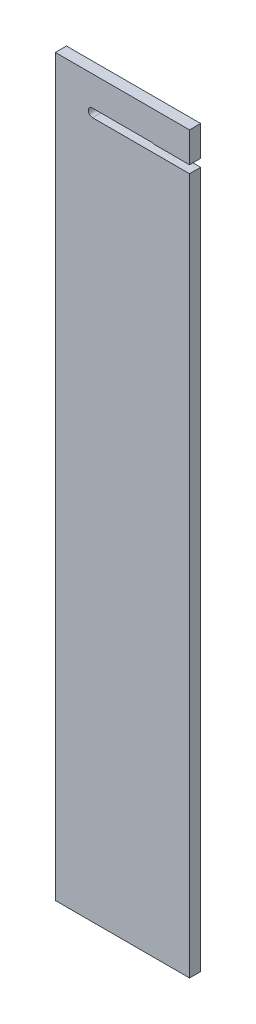
ISO-10303-21;
HEADER;
FILE_DESCRIPTION(('STEP AP214'),'2;1');
FILE_NAME('part.step','',(''),(''),'','','');
FILE_SCHEMA(('AUTOMOTIVE_DESIGN { 1 0 10303 214 1 1 1 1 }'));
ENDSEC;
DATA;
#1=APPLICATION_CONTEXT('core data for automotive mechanical design processes');
#2=APPLICATION_PROTOCOL_DEFINITION('international standard','automotive_design',2000,#1);
#3=PRODUCT_CONTEXT('',#1,'mechanical');
#4=PRODUCT('Part','Part','',(#3));
#5=PRODUCT_RELATED_PRODUCT_CATEGORY('part','',(#4));
#6=PRODUCT_DEFINITION_FORMATION('','',#4);
#7=PRODUCT_DEFINITION_CONTEXT('part definition',#1,'design');
#8=PRODUCT_DEFINITION('design','',#6,#7);
#9=PRODUCT_DEFINITION_SHAPE('','',#8);
#10=(LENGTH_UNIT() NAMED_UNIT(*) SI_UNIT(.MILLI.,.METRE.));
#11=(NAMED_UNIT(*) PLANE_ANGLE_UNIT() SI_UNIT($,.RADIAN.));
#12=(NAMED_UNIT(*) SI_UNIT($,.STERADIAN.) SOLID_ANGLE_UNIT());
#13=UNCERTAINTY_MEASURE_WITH_UNIT(LENGTH_MEASURE(1.E-05),#10,'distance_accuracy_value','');
#14=(GEOMETRIC_REPRESENTATION_CONTEXT(3) GLOBAL_UNCERTAINTY_ASSIGNED_CONTEXT((#13)) GLOBAL_UNIT_ASSIGNED_CONTEXT((#10,
#11,#12)) REPRESENTATION_CONTEXT('',''));
#15=CARTESIAN_POINT('',(0.,0.,0.));
#16=DIRECTION('',(0.,0.,1.));
#17=DIRECTION('',(1.,0.,0.));
#18=AXIS2_PLACEMENT_3D('',#15,#16,#17);
#19=CARTESIAN_POINT('',(28.75,0.,4.7625));
#20=DIRECTION('',(1.,0.,0.));
#21=DIRECTION('',(0.,0.,-1.));
#22=AXIS2_PLACEMENT_3D('',#19,#20,#21);
#23=PLANE('',#22);
#24=DIRECTION('',(0.,-1.,0.));
#25=VECTOR('',#24,1.);
#26=CARTESIAN_POINT('',(28.75,0.,0.));
#27=LINE('',#26,#25);
#28=CARTESIAN_POINT('',(28.75,149.225,0.));
#29=VERTEX_POINT('',#28);
#30=CARTESIAN_POINT('',(28.75,-149.225,0.));
#31=VERTEX_POINT('',#30);
#32=EDGE_CURVE('E120',#29,#31,#27,.T.);
#33=ORIENTED_EDGE('',*,*,#32,.F.);
#34=DIRECTION('',(0.,0.,-1.));
#35=VECTOR('',#34,1.);
#36=CARTESIAN_POINT('',(28.75,149.225,4.7625));
#37=LINE('',#36,#35);
#38=CARTESIAN_POINT('',(28.75,149.225,4.7625));
#39=VERTEX_POINT('',#38);
#40=EDGE_CURVE('E116',#39,#29,#37,.T.);
#41=ORIENTED_EDGE('',*,*,#40,.F.);
#42=DIRECTION('',(0.,-1.,0.));
#43=VECTOR('',#42,1.);
#44=CARTESIAN_POINT('',(28.75,0.,4.7625));
#45=LINE('',#44,#43);
#46=CARTESIAN_POINT('',(28.75,-149.225,4.7625));
#47=VERTEX_POINT('',#46);
#48=EDGE_CURVE('E118',#39,#47,#45,.T.);
#49=ORIENTED_EDGE('',*,*,#48,.T.);
#50=DIRECTION('',(0.,0.,-1.));
#51=VECTOR('',#50,1.);
#52=CARTESIAN_POINT('',(28.75,-149.225,4.7625));
#53=LINE('',#52,#51);
#54=EDGE_CURVE('E156',#47,#31,#53,.T.);
#55=ORIENTED_EDGE('',*,*,#54,.T.);
#56=EDGE_LOOP('',(#33,#41,#49,#55));
#57=FACE_BOUND('',#56,.T.);
#58=ADVANCED_FACE('F39',(#57),#23,.T.);
#59=CARTESIAN_POINT('',(0.,149.225,4.7625));
#60=DIRECTION('',(0.,1.,0.));
#61=DIRECTION('',(0.,0.,1.));
#62=AXIS2_PLACEMENT_3D('',#59,#60,#61);
#63=PLANE('',#62);
#64=DIRECTION('',(1.,0.,0.));
#65=VECTOR('',#64,1.);
#66=CARTESIAN_POINT('',(0.,149.225,0.));
#67=LINE('',#66,#65);
#68=CARTESIAN_POINT('',(-12.827,149.225,0.));
#69=VERTEX_POINT('',#68);
#70=EDGE_CURVE('E158',#69,#29,#67,.T.);
#71=ORIENTED_EDGE('',*,*,#70,.F.);
#72=DIRECTION('',(0.,0.,-1.));
#73=VECTOR('',#72,1.);
#74=CARTESIAN_POINT('',(-12.827,149.225,4.7625));
#75=LINE('',#74,#73);
#76=CARTESIAN_POINT('',(-12.827,149.225,4.7625));
#77=VERTEX_POINT('',#76);
#78=EDGE_CURVE('E126',#77,#69,#75,.T.);
#79=ORIENTED_EDGE('',*,*,#78,.F.);
#80=DIRECTION('',(1.,0.,0.));
#81=VECTOR('',#80,1.);
#82=CARTESIAN_POINT('',(0.,149.225,4.7625));
#83=LINE('',#82,#81);
#84=EDGE_CURVE('E131',#77,#39,#83,.T.);
#85=ORIENTED_EDGE('',*,*,#84,.T.);
#86=ORIENTED_EDGE('',*,*,#40,.T.);
#87=EDGE_LOOP('',(#71,#79,#85,#86));
#88=FACE_BOUND('',#87,.T.);
#89=ADVANCED_FACE('F138',(#88),#63,.T.);
#90=CARTESIAN_POINT('',(-12.827,151.003,4.7625));
#91=DIRECTION('',(0.,0.,-1.));
#92=DIRECTION('',(-1.,0.,0.));
#93=AXIS2_PLACEMENT_3D('',#90,#91,#92);
#94=CYLINDRICAL_SURFACE('',#93,1.778);
#95=CARTESIAN_POINT('',(-12.827,151.003,0.));
#96=DIRECTION('',(0.,0.,1.));
#97=DIRECTION('',(1.,0.,0.));
#98=AXIS2_PLACEMENT_3D('',#95,#96,#97);
#99=CIRCLE('',#98,1.778);
#100=CARTESIAN_POINT('',(-12.827,152.781,0.));
#101=VERTEX_POINT('',#100);
#102=EDGE_CURVE('E160',#101,#69,#99,.T.);
#103=ORIENTED_EDGE('',*,*,#102,.F.);
#104=DIRECTION('',(0.,0.,-1.));
#105=VECTOR('',#104,1.);
#106=CARTESIAN_POINT('',(-12.827,152.781,4.7625));
#107=LINE('',#106,#105);
#108=CARTESIAN_POINT('',(-12.827,152.781,4.7625));
#109=VERTEX_POINT('',#108);
#110=EDGE_CURVE('E191',#109,#101,#107,.T.);
#111=ORIENTED_EDGE('',*,*,#110,.F.);
#112=CARTESIAN_POINT('',(-12.827,151.003,4.7625));
#113=DIRECTION('',(0.,0.,1.));
#114=DIRECTION('',(1.,0.,0.));
#115=AXIS2_PLACEMENT_3D('',#112,#113,#114);
#116=CIRCLE('',#115,1.778);
#117=EDGE_CURVE('E139',#109,#77,#116,.T.);
#118=ORIENTED_EDGE('',*,*,#117,.T.);
#119=ORIENTED_EDGE('',*,*,#78,.T.);
#120=EDGE_LOOP('',(#103,#111,#118,#119));
#121=FACE_BOUND('',#120,.T.);
#122=ADVANCED_FACE('F221',(#121),#94,.F.);
#123=CARTESIAN_POINT('',(0.,152.781,4.7625));
#124=DIRECTION('',(0.,-1.,0.));
#125=DIRECTION('',(0.,0.,-1.));
#126=AXIS2_PLACEMENT_3D('',#123,#124,#125);
#127=PLANE('',#126);
#128=DIRECTION('',(-1.,0.,0.));
#129=VECTOR('',#128,1.);
#130=CARTESIAN_POINT('',(0.,152.781,0.));
#131=LINE('',#130,#129);
#132=CARTESIAN_POINT('',(12.827,152.781,0.));
#133=VERTEX_POINT('',#132);
#134=EDGE_CURVE('E163',#133,#101,#131,.T.);
#135=ORIENTED_EDGE('',*,*,#134,.F.);
#136=DIRECTION('',(0.,0.,-1.));
#137=VECTOR('',#136,1.);
#138=CARTESIAN_POINT('',(12.827,152.781,4.7625));
#139=LINE('',#138,#137);
#140=CARTESIAN_POINT('',(12.827,152.781,4.7625));
#141=VERTEX_POINT('',#140);
#142=EDGE_CURVE('E189',#141,#133,#139,.T.);
#143=ORIENTED_EDGE('',*,*,#142,.F.);
#144=DIRECTION('',(-1.,0.,0.));
#145=VECTOR('',#144,1.);
#146=CARTESIAN_POINT('',(0.,152.781,4.7625));
#147=LINE('',#146,#145);
#148=EDGE_CURVE('E141',#141,#109,#147,.T.);
#149=ORIENTED_EDGE('',*,*,#148,.T.);
#150=ORIENTED_EDGE('',*,*,#110,.T.);
#151=EDGE_LOOP('',(#135,#143,#149,#150));
#152=FACE_BOUND('',#151,.T.);
#153=ADVANCED_FACE('F200',(#152),#127,.T.);
#154=CARTESIAN_POINT('',(0.,152.527,4.7625));
#155=DIRECTION('',(0.,-1.,0.));
#156=DIRECTION('',(0.,0.,-1.));
#157=AXIS2_PLACEMENT_3D('',#154,#155,#156);
#158=PLANE('',#157);
#159=DIRECTION('',(-1.,0.,0.));
#160=VECTOR('',#159,1.);
#161=CARTESIAN_POINT('',(0.,152.527,4.7625));
#162=LINE('',#161,#160);
#163=CARTESIAN_POINT('',(28.75,152.527,4.7625));
#164=VERTEX_POINT('',#163);
#165=CARTESIAN_POINT('',(14.0713407893338,152.527,4.7625));
#166=VERTEX_POINT('',#165);
#167=EDGE_CURVE('E146',#164,#166,#162,.T.);
#168=ORIENTED_EDGE('',*,*,#167,.T.);
#169=DIRECTION('',(0.,0.,-1.));
#170=VECTOR('',#169,1.);
#171=CARTESIAN_POINT('',(14.0713407893338,152.527,0.));
#172=LINE('',#171,#170);
#173=CARTESIAN_POINT('',(14.0713407893338,152.527,0.));
#174=VERTEX_POINT('',#173);
#175=EDGE_CURVE('E125',#166,#174,#172,.T.);
#176=ORIENTED_EDGE('',*,*,#175,.T.);
#177=DIRECTION('',(-1.,0.,0.));
#178=VECTOR('',#177,1.);
#179=CARTESIAN_POINT('',(0.,152.527,0.));
#180=LINE('',#179,#178);
#181=CARTESIAN_POINT('',(28.75,152.527,0.));
#182=VERTEX_POINT('',#181);
#183=EDGE_CURVE('E166',#182,#174,#180,.T.);
#184=ORIENTED_EDGE('',*,*,#183,.F.);
#185=DIRECTION('',(0.,0.,-1.));
#186=VECTOR('',#185,1.);
#187=CARTESIAN_POINT('',(28.75,152.527,4.7625));
#188=LINE('',#187,#186);
#189=EDGE_CURVE('E187',#164,#182,#188,.T.);
#190=ORIENTED_EDGE('',*,*,#189,.F.);
#191=EDGE_LOOP('',(#168,#176,#184,#190));
#192=FACE_BOUND('',#191,.T.);
#193=ADVANCED_FACE('F203',(#192),#158,.T.);
#194=CARTESIAN_POINT('',(28.75,0.,4.7625));
#195=DIRECTION('',(-1.,0.,0.));
#196=DIRECTION('',(0.,0.,1.));
#197=AXIS2_PLACEMENT_3D('',#194,#195,#196);
#198=PLANE('',#197);
#199=DIRECTION('',(0.,1.,0.));
#200=VECTOR('',#199,1.);
#201=CARTESIAN_POINT('',(28.75,0.,0.));
#202=LINE('',#201,#200);
#203=CARTESIAN_POINT('',(28.75,165.481,0.));
#204=VERTEX_POINT('',#203);
#205=EDGE_CURVE('E169',#182,#204,#202,.T.);
#206=ORIENTED_EDGE('',*,*,#205,.T.);
#207=DIRECTION('',(0.,0.,-1.));
#208=VECTOR('',#207,1.);
#209=CARTESIAN_POINT('',(28.75,165.481,4.7625));
#210=LINE('',#209,#208);
#211=CARTESIAN_POINT('',(28.75,165.481,4.7625));
#212=VERTEX_POINT('',#211);
#213=EDGE_CURVE('E185',#212,#204,#210,.T.);
#214=ORIENTED_EDGE('',*,*,#213,.F.);
#215=DIRECTION('',(0.,1.,0.));
#216=VECTOR('',#215,1.);
#217=CARTESIAN_POINT('',(28.75,0.,4.7625));
#218=LINE('',#217,#216);
#219=EDGE_CURVE('E148',#164,#212,#218,.T.);
#220=ORIENTED_EDGE('',*,*,#219,.F.);
#221=ORIENTED_EDGE('',*,*,#189,.T.);
#222=EDGE_LOOP('',(#206,#214,#220,#221));
#223=FACE_BOUND('',#222,.T.);
#224=ADVANCED_FACE('F208',(#223),#198,.F.);
#225=CARTESIAN_POINT('',(0.,165.481,4.7625));
#226=DIRECTION('',(0.,1.,0.));
#227=DIRECTION('',(0.,0.,1.));
#228=AXIS2_PLACEMENT_3D('',#225,#226,#227);
#229=PLANE('',#228);
#230=DIRECTION('',(1.,0.,0.));
#231=VECTOR('',#230,1.);
#232=CARTESIAN_POINT('',(0.,165.481,0.));
#233=LINE('',#232,#231);
#234=CARTESIAN_POINT('',(-28.75,165.481,0.));
#235=VERTEX_POINT('',#234);
#236=EDGE_CURVE('E172',#235,#204,#233,.T.);
#237=ORIENTED_EDGE('',*,*,#236,.F.);
#238=DIRECTION('',(0.,0.,-1.));
#239=VECTOR('',#238,1.);
#240=CARTESIAN_POINT('',(-28.75,165.481,4.7625));
#241=LINE('',#240,#239);
#242=CARTESIAN_POINT('',(-28.75,165.481,4.7625));
#243=VERTEX_POINT('',#242);
#244=EDGE_CURVE('E183',#243,#235,#241,.T.);
#245=ORIENTED_EDGE('',*,*,#244,.F.);
#246=DIRECTION('',(1.,0.,0.));
#247=VECTOR('',#246,1.);
#248=CARTESIAN_POINT('',(0.,165.481,4.7625));
#249=LINE('',#248,#247);
#250=EDGE_CURVE('E150',#243,#212,#249,.T.);
#251=ORIENTED_EDGE('',*,*,#250,.T.);
#252=ORIENTED_EDGE('',*,*,#213,.T.);
#253=EDGE_LOOP('',(#237,#245,#251,#252));
#254=FACE_BOUND('',#253,.T.);
#255=ADVANCED_FACE('F211',(#254),#229,.T.);
#256=CARTESIAN_POINT('',(-28.75,0.,4.7625));
#257=DIRECTION('',(1.,0.,0.));
#258=DIRECTION('',(0.,0.,-1.));
#259=AXIS2_PLACEMENT_3D('',#256,#257,#258);
#260=PLANE('',#259);
#261=DIRECTION('',(0.,-1.,0.));
#262=VECTOR('',#261,1.);
#263=CARTESIAN_POINT('',(-28.75,0.,0.));
#264=LINE('',#263,#262);
#265=CARTESIAN_POINT('',(-28.75,-149.225,0.));
#266=VERTEX_POINT('',#265);
#267=EDGE_CURVE('E175',#235,#266,#264,.T.);
#268=ORIENTED_EDGE('',*,*,#267,.T.);
#269=DIRECTION('',(0.,0.,-1.));
#270=VECTOR('',#269,1.);
#271=CARTESIAN_POINT('',(-28.75,-149.225,4.7625));
#272=LINE('',#271,#270);
#273=CARTESIAN_POINT('',(-28.75,-149.225,4.7625));
#274=VERTEX_POINT('',#273);
#275=EDGE_CURVE('E180',#274,#266,#272,.T.);
#276=ORIENTED_EDGE('',*,*,#275,.F.);
#277=DIRECTION('',(0.,-1.,0.));
#278=VECTOR('',#277,1.);
#279=CARTESIAN_POINT('',(-28.75,0.,4.7625));
#280=LINE('',#279,#278);
#281=EDGE_CURVE('E153',#243,#274,#280,.T.);
#282=ORIENTED_EDGE('',*,*,#281,.F.);
#283=ORIENTED_EDGE('',*,*,#244,.T.);
#284=EDGE_LOOP('',(#268,#276,#282,#283));
#285=FACE_BOUND('',#284,.T.);
#286=ADVANCED_FACE('F216',(#285),#260,.F.);
#287=CARTESIAN_POINT('',(0.,-149.225,4.7625));
#288=DIRECTION('',(0.,1.,0.));
#289=DIRECTION('',(0.,0.,1.));
#290=AXIS2_PLACEMENT_3D('',#287,#288,#289);
#291=PLANE('',#290);
#292=DIRECTION('',(1.,0.,0.));
#293=VECTOR('',#292,1.);
#294=CARTESIAN_POINT('',(0.,-149.225,0.));
#295=LINE('',#294,#293);
#296=EDGE_CURVE('E136',#266,#31,#295,.T.);
#297=ORIENTED_EDGE('',*,*,#296,.T.);
#298=ORIENTED_EDGE('',*,*,#54,.F.);
#299=DIRECTION('',(1.,0.,0.));
#300=VECTOR('',#299,1.);
#301=CARTESIAN_POINT('',(0.,-149.225,4.7625));
#302=LINE('',#301,#300);
#303=EDGE_CURVE('E134',#274,#47,#302,.T.);
#304=ORIENTED_EDGE('',*,*,#303,.F.);
#305=ORIENTED_EDGE('',*,*,#275,.T.);
#306=EDGE_LOOP('',(#297,#298,#304,#305));
#307=FACE_BOUND('',#306,.T.);
#308=ADVANCED_FACE('F219',(#307),#291,.F.);
#309=CARTESIAN_POINT('',(0.,0.,4.7625));
#310=DIRECTION('',(0.,0.,1.));
#311=DIRECTION('',(1.,0.,0.));
#312=AXIS2_PLACEMENT_3D('',#309,#310,#311);
#313=PLANE('',#312);
#314=ORIENTED_EDGE('',*,*,#148,.F.);
#315=CARTESIAN_POINT('',(14.0713407893338,155.702,4.7625));
#316=DIRECTION('',(0.,0.,1.));
#317=DIRECTION('',(1.,0.,0.));
#318=AXIS2_PLACEMENT_3D('',#315,#316,#317);
#319=CIRCLE('',#318,3.175);
#320=EDGE_CURVE('E11',#141,#166,#319,.T.);
#321=ORIENTED_EDGE('',*,*,#320,.T.);
#322=ORIENTED_EDGE('',*,*,#167,.F.);
#323=ORIENTED_EDGE('',*,*,#219,.T.);
#324=ORIENTED_EDGE('',*,*,#250,.F.);
#325=ORIENTED_EDGE('',*,*,#281,.T.);
#326=ORIENTED_EDGE('',*,*,#303,.T.);
#327=ORIENTED_EDGE('',*,*,#48,.F.);
#328=ORIENTED_EDGE('',*,*,#84,.F.);
#329=ORIENTED_EDGE('',*,*,#117,.F.);
#330=EDGE_LOOP('',(#314,#321,#322,#323,#324,#325,#326,#327,#328,#329));
#331=FACE_BOUND('',#330,.T.);
#332=ADVANCED_FACE('F129',(#331),#313,.T.);
#333=CARTESIAN_POINT('',(0.,0.,0.));
#334=DIRECTION('',(0.,0.,1.));
#335=DIRECTION('',(1.,0.,0.));
#336=AXIS2_PLACEMENT_3D('',#333,#334,#335);
#337=PLANE('',#336);
#338=ORIENTED_EDGE('',*,*,#183,.T.);
#339=CARTESIAN_POINT('',(14.0713407893338,155.702,0.));
#340=DIRECTION('',(0.,0.,1.));
#341=DIRECTION('',(1.,0.,0.));
#342=AXIS2_PLACEMENT_3D('',#339,#340,#341);
#343=CIRCLE('',#342,3.175);
#344=EDGE_CURVE('E47',#174,#133,#343,.F.);
#345=ORIENTED_EDGE('',*,*,#344,.T.);
#346=ORIENTED_EDGE('',*,*,#134,.T.);
#347=ORIENTED_EDGE('',*,*,#102,.T.);
#348=ORIENTED_EDGE('',*,*,#70,.T.);
#349=ORIENTED_EDGE('',*,*,#32,.T.);
#350=ORIENTED_EDGE('',*,*,#296,.F.);
#351=ORIENTED_EDGE('',*,*,#267,.F.);
#352=ORIENTED_EDGE('',*,*,#236,.T.);
#353=ORIENTED_EDGE('',*,*,#205,.F.);
#354=EDGE_LOOP('',(#338,#345,#346,#347,#348,#349,#350,#351,#352,#353));
#355=FACE_BOUND('',#354,.T.);
#356=ADVANCED_FACE('F196',(#355),#337,.F.);
#357=CARTESIAN_POINT('',(14.0713407893338,155.702,4.7625));
#358=DIRECTION('',(0.,0.,1.));
#359=DIRECTION('',(1.,0.,0.));
#360=AXIS2_PLACEMENT_3D('',#357,#358,#359);
#361=CYLINDRICAL_SURFACE('',#360,3.175);
#362=ORIENTED_EDGE('',*,*,#320,.F.);
#363=ORIENTED_EDGE('',*,*,#142,.T.);
#364=ORIENTED_EDGE('',*,*,#344,.F.);
#365=ORIENTED_EDGE('',*,*,#175,.F.);
#366=EDGE_LOOP('',(#362,#363,#364,#365));
#367=FACE_BOUND('',#366,.T.);
#368=ADVANCED_FACE('F41',(#367),#361,.T.);
#369=CLOSED_SHELL('',(#58,#89,#122,#153,#193,#224,#255,#286,#308,#332,#356,#368));
#370=MANIFOLD_SOLID_BREP('B2',#369);
#371=ADVANCED_BREP_SHAPE_REPRESENTATION('',(#18,#370),#14);
#372=SHAPE_DEFINITION_REPRESENTATION(#9,#371);
ENDSEC;
END-ISO-10303-21;
